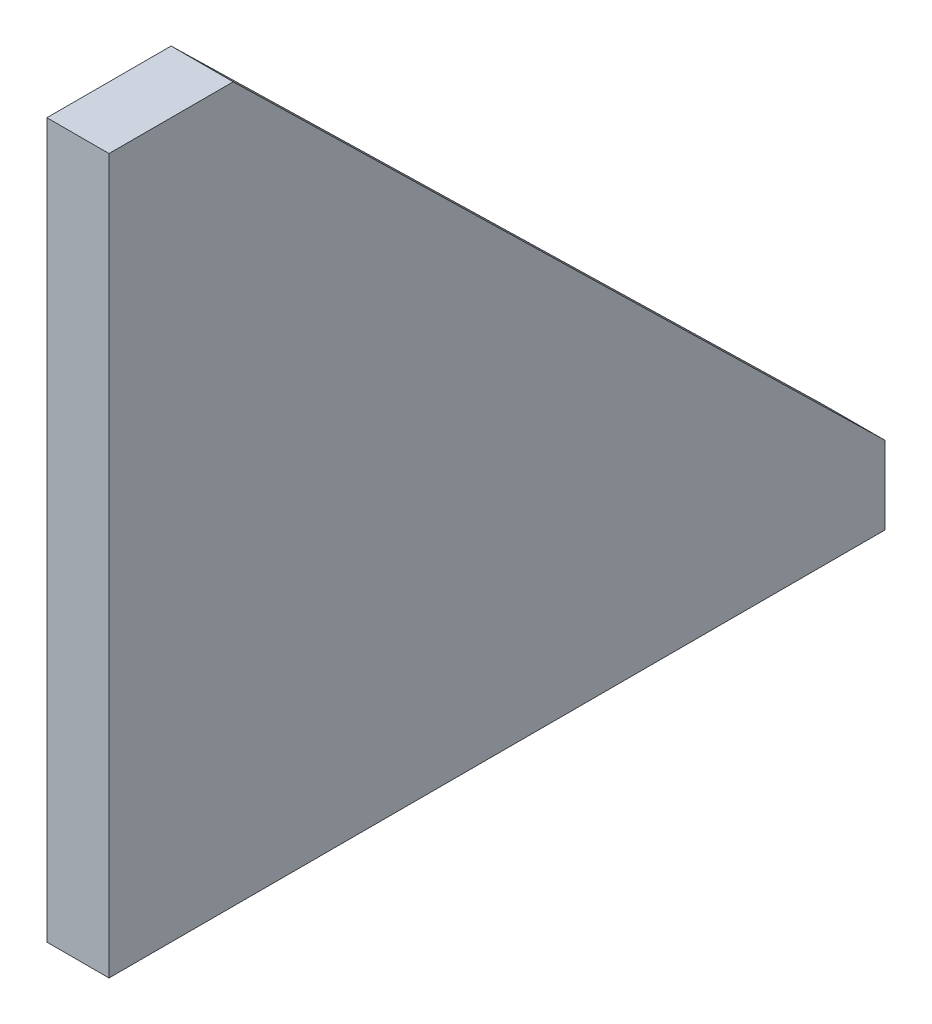
ISO-10303-21;
HEADER;
FILE_DESCRIPTION(('STEP AP214'),'2;1');
FILE_NAME('part.step','',(''),(''),'','','');
FILE_SCHEMA(('AUTOMOTIVE_DESIGN { 1 0 10303 214 1 1 1 1 }'));
ENDSEC;
DATA;
#1=APPLICATION_CONTEXT('core data for automotive mechanical design processes');
#2=APPLICATION_PROTOCOL_DEFINITION('international standard','automotive_design',2000,#1);
#3=PRODUCT_CONTEXT('',#1,'mechanical');
#4=PRODUCT('Part','Part','',(#3));
#5=PRODUCT_RELATED_PRODUCT_CATEGORY('part','',(#4));
#6=PRODUCT_DEFINITION_FORMATION('','',#4);
#7=PRODUCT_DEFINITION_CONTEXT('part definition',#1,'design');
#8=PRODUCT_DEFINITION('design','',#6,#7);
#9=PRODUCT_DEFINITION_SHAPE('','',#8);
#10=(LENGTH_UNIT() NAMED_UNIT(*) SI_UNIT(.MILLI.,.METRE.));
#11=(NAMED_UNIT(*) PLANE_ANGLE_UNIT() SI_UNIT($,.RADIAN.));
#12=(NAMED_UNIT(*) SI_UNIT($,.STERADIAN.) SOLID_ANGLE_UNIT());
#13=UNCERTAINTY_MEASURE_WITH_UNIT(LENGTH_MEASURE(1.E-05),#10,'distance_accuracy_value','');
#14=(GEOMETRIC_REPRESENTATION_CONTEXT(3) GLOBAL_UNCERTAINTY_ASSIGNED_CONTEXT((#13)) GLOBAL_UNIT_ASSIGNED_CONTEXT((#10,
#11,#12)) REPRESENTATION_CONTEXT('',''));
#15=CARTESIAN_POINT('',(0.,0.,0.));
#16=DIRECTION('',(0.,0.,1.));
#17=DIRECTION('',(1.,0.,0.));
#18=AXIS2_PLACEMENT_3D('',#15,#16,#17);
#19=CARTESIAN_POINT('',(20.,-115.,125.));
#20=DIRECTION('',(0.,0.,-1.));
#21=DIRECTION('',(-1.,0.,0.));
#22=AXIS2_PLACEMENT_3D('',#19,#20,#21);
#23=PLANE('',#22);
#24=DIRECTION('',(0.,-1.,0.));
#25=VECTOR('',#24,1.);
#26=CARTESIAN_POINT('',(0.,-115.,125.));
#27=LINE('',#26,#25);
#28=CARTESIAN_POINT('',(0.,115.,125.));
#29=VERTEX_POINT('',#28);
#30=CARTESIAN_POINT('',(0.,-115.,125.));
#31=VERTEX_POINT('',#30);
#32=EDGE_CURVE('E107',#29,#31,#27,.T.);
#33=ORIENTED_EDGE('',*,*,#32,.T.);
#34=DIRECTION('',(-1.,0.,0.));
#35=VECTOR('',#34,1.);
#36=CARTESIAN_POINT('',(20.,-115.,125.));
#37=LINE('',#36,#35);
#38=CARTESIAN_POINT('',(20.,-115.,125.));
#39=VERTEX_POINT('',#38);
#40=EDGE_CURVE('E11',#39,#31,#37,.T.);
#41=ORIENTED_EDGE('',*,*,#40,.F.);
#42=DIRECTION('',(0.,-1.,0.));
#43=VECTOR('',#42,1.);
#44=CARTESIAN_POINT('',(20.,-115.,125.));
#45=LINE('',#44,#43);
#46=CARTESIAN_POINT('',(20.,115.,125.));
#47=VERTEX_POINT('',#46);
#48=EDGE_CURVE('E115',#47,#39,#45,.T.);
#49=ORIENTED_EDGE('',*,*,#48,.F.);
#50=DIRECTION('',(-1.,0.,0.));
#51=VECTOR('',#50,1.);
#52=CARTESIAN_POINT('',(20.,115.,125.));
#53=LINE('',#52,#51);
#54=EDGE_CURVE('E103',#47,#29,#53,.T.);
#55=ORIENTED_EDGE('',*,*,#54,.T.);
#56=EDGE_LOOP('',(#33,#41,#49,#55));
#57=FACE_BOUND('',#56,.T.);
#58=ADVANCED_FACE('F33',(#57),#23,.F.);
#59=CARTESIAN_POINT('',(20.,-115.,125.));
#60=DIRECTION('',(0.,1.,0.));
#61=DIRECTION('',(0.,0.,1.));
#62=AXIS2_PLACEMENT_3D('',#59,#60,#61);
#63=PLANE('',#62);
#64=DIRECTION('',(0.,0.,-1.));
#65=VECTOR('',#64,1.);
#66=CARTESIAN_POINT('',(0.,-115.,125.));
#67=LINE('',#66,#65);
#68=CARTESIAN_POINT('',(0.,-115.,-125.));
#69=VERTEX_POINT('',#68);
#70=EDGE_CURVE('E110',#31,#69,#67,.T.);
#71=ORIENTED_EDGE('',*,*,#70,.T.);
#72=DIRECTION('',(-1.,0.,0.));
#73=VECTOR('',#72,1.);
#74=CARTESIAN_POINT('',(20.,-115.,-125.));
#75=LINE('',#74,#73);
#76=CARTESIAN_POINT('',(20.,-115.,-125.));
#77=VERTEX_POINT('',#76);
#78=EDGE_CURVE('E41',#77,#69,#75,.T.);
#79=ORIENTED_EDGE('',*,*,#78,.F.);
#80=DIRECTION('',(0.,0.,-1.));
#81=VECTOR('',#80,1.);
#82=CARTESIAN_POINT('',(20.,-115.,125.));
#83=LINE('',#82,#81);
#84=EDGE_CURVE('E83',#39,#77,#83,.T.);
#85=ORIENTED_EDGE('',*,*,#84,.F.);
#86=ORIENTED_EDGE('',*,*,#40,.T.);
#87=EDGE_LOOP('',(#71,#79,#85,#86));
#88=FACE_BOUND('',#87,.T.);
#89=ADVANCED_FACE('F134',(#88),#63,.F.);
#90=CARTESIAN_POINT('',(20.,-115.,-125.));
#91=DIRECTION('',(0.,0.,1.));
#92=DIRECTION('',(1.,0.,0.));
#93=AXIS2_PLACEMENT_3D('',#90,#91,#92);
#94=PLANE('',#93);
#95=DIRECTION('',(0.,1.,0.));
#96=VECTOR('',#95,1.);
#97=CARTESIAN_POINT('',(0.,-115.,-125.));
#98=LINE('',#97,#96);
#99=CARTESIAN_POINT('',(0.,-90.,-125.));
#100=VERTEX_POINT('',#99);
#101=EDGE_CURVE('E98',#69,#100,#98,.T.);
#102=ORIENTED_EDGE('',*,*,#101,.T.);
#103=DIRECTION('',(-1.,0.,0.));
#104=VECTOR('',#103,1.);
#105=CARTESIAN_POINT('',(20.,-90.,-125.));
#106=LINE('',#105,#104);
#107=CARTESIAN_POINT('',(20.,-90.,-125.));
#108=VERTEX_POINT('',#107);
#109=EDGE_CURVE('E95',#108,#100,#106,.T.);
#110=ORIENTED_EDGE('',*,*,#109,.F.);
#111=DIRECTION('',(0.,1.,0.));
#112=VECTOR('',#111,1.);
#113=CARTESIAN_POINT('',(20.,-115.,-125.));
#114=LINE('',#113,#112);
#115=EDGE_CURVE('E87',#77,#108,#114,.T.);
#116=ORIENTED_EDGE('',*,*,#115,.F.);
#117=ORIENTED_EDGE('',*,*,#78,.T.);
#118=EDGE_LOOP('',(#102,#110,#116,#117));
#119=FACE_BOUND('',#118,.T.);
#120=ADVANCED_FACE('F96',(#119),#94,.F.);
#121=CARTESIAN_POINT('',(20.,115.,85.));
#122=DIRECTION('',(0.,-0.715574205880785,0.698536724788385));
#123=DIRECTION('',(0.,-0.698536724788385,-0.715574205880785));
#124=AXIS2_PLACEMENT_3D('',#121,#122,#123);
#125=PLANE('',#124);
#126=DIRECTION('',(0.,0.698536724788385,0.715574205880785));
#127=VECTOR('',#126,1.);
#128=CARTESIAN_POINT('',(0.,115.,85.));
#129=LINE('',#128,#127);
#130=CARTESIAN_POINT('',(0.,115.,85.));
#131=VERTEX_POINT('',#130);
#132=EDGE_CURVE('E69',#100,#131,#129,.T.);
#133=ORIENTED_EDGE('',*,*,#132,.T.);
#134=DIRECTION('',(-1.,0.,0.));
#135=VECTOR('',#134,1.);
#136=CARTESIAN_POINT('',(20.,115.,85.));
#137=LINE('',#136,#135);
#138=CARTESIAN_POINT('',(20.,115.,85.));
#139=VERTEX_POINT('',#138);
#140=EDGE_CURVE('E99',#139,#131,#137,.T.);
#141=ORIENTED_EDGE('',*,*,#140,.F.);
#142=DIRECTION('',(0.,0.698536724788385,0.715574205880785));
#143=VECTOR('',#142,1.);
#144=CARTESIAN_POINT('',(20.,115.,85.));
#145=LINE('',#144,#143);
#146=EDGE_CURVE('E91',#108,#139,#145,.T.);
#147=ORIENTED_EDGE('',*,*,#146,.F.);
#148=ORIENTED_EDGE('',*,*,#109,.T.);
#149=EDGE_LOOP('',(#133,#141,#147,#148));
#150=FACE_BOUND('',#149,.T.);
#151=ADVANCED_FACE('F101',(#150),#125,.F.);
#152=CARTESIAN_POINT('',(20.,115.,125.));
#153=DIRECTION('',(0.,-1.,0.));
#154=DIRECTION('',(0.,0.,-1.));
#155=AXIS2_PLACEMENT_3D('',#152,#153,#154);
#156=PLANE('',#155);
#157=DIRECTION('',(0.,0.,1.));
#158=VECTOR('',#157,1.);
#159=CARTESIAN_POINT('',(0.,115.,125.));
#160=LINE('',#159,#158);
#161=EDGE_CURVE('E75',#131,#29,#160,.T.);
#162=ORIENTED_EDGE('',*,*,#161,.T.);
#163=ORIENTED_EDGE('',*,*,#54,.F.);
#164=DIRECTION('',(0.,0.,1.));
#165=VECTOR('',#164,1.);
#166=CARTESIAN_POINT('',(20.,115.,125.));
#167=LINE('',#166,#165);
#168=EDGE_CURVE('E49',#139,#47,#167,.T.);
#169=ORIENTED_EDGE('',*,*,#168,.F.);
#170=ORIENTED_EDGE('',*,*,#140,.T.);
#171=EDGE_LOOP('',(#162,#163,#169,#170));
#172=FACE_BOUND('',#171,.T.);
#173=ADVANCED_FACE('F123',(#172),#156,.F.);
#174=CARTESIAN_POINT('',(20.,0.,0.));
#175=DIRECTION('',(-1.,0.,0.));
#176=DIRECTION('',(0.,0.,1.));
#177=AXIS2_PLACEMENT_3D('',#174,#175,#176);
#178=PLANE('',#177);
#179=ORIENTED_EDGE('',*,*,#48,.T.);
#180=ORIENTED_EDGE('',*,*,#84,.T.);
#181=ORIENTED_EDGE('',*,*,#115,.T.);
#182=ORIENTED_EDGE('',*,*,#146,.T.);
#183=ORIENTED_EDGE('',*,*,#168,.T.);
#184=EDGE_LOOP('',(#179,#180,#181,#182,#183));
#185=FACE_BOUND('',#184,.T.);
#186=ADVANCED_FACE('F89',(#185),#178,.F.);
#187=CARTESIAN_POINT('',(0.,0.,0.));
#188=DIRECTION('',(-1.,0.,0.));
#189=DIRECTION('',(0.,0.,1.));
#190=AXIS2_PLACEMENT_3D('',#187,#188,#189);
#191=PLANE('',#190);
#192=ORIENTED_EDGE('',*,*,#32,.F.);
#193=ORIENTED_EDGE('',*,*,#161,.F.);
#194=ORIENTED_EDGE('',*,*,#132,.F.);
#195=ORIENTED_EDGE('',*,*,#101,.F.);
#196=ORIENTED_EDGE('',*,*,#70,.F.);
#197=EDGE_LOOP('',(#192,#193,#194,#195,#196));
#198=FACE_BOUND('',#197,.T.);
#199=ADVANCED_FACE('F119',(#198),#191,.T.);
#200=CLOSED_SHELL('',(#58,#89,#120,#151,#173,#186,#199));
#201=MANIFOLD_SOLID_BREP('B2',#200);
#202=ADVANCED_BREP_SHAPE_REPRESENTATION('',(#18,#201),#14);
#203=SHAPE_DEFINITION_REPRESENTATION(#9,#202);
ENDSEC;
END-ISO-10303-21;
